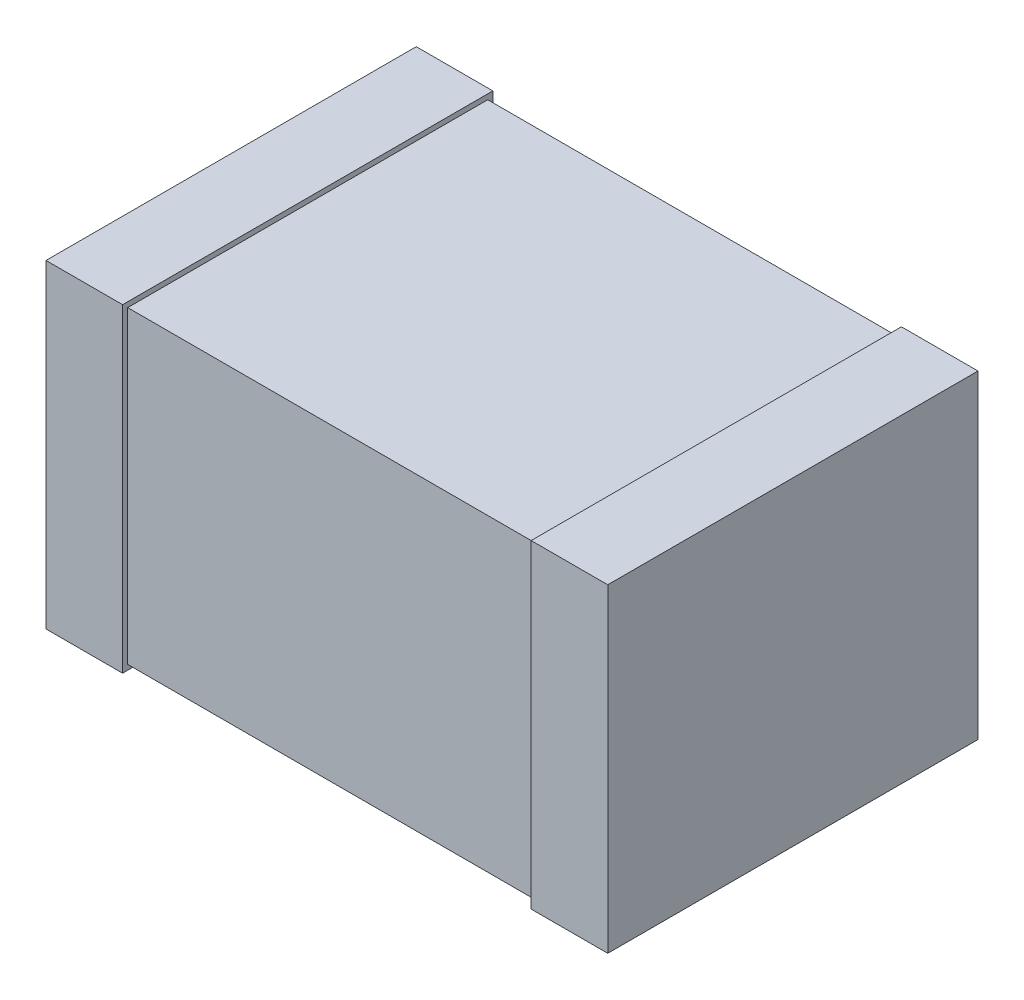
ISO-10303-21;
HEADER;
FILE_DESCRIPTION(('STEP AP214'),'2;1');
FILE_NAME('part.step','',(''),(''),'','','');
FILE_SCHEMA(('AUTOMOTIVE_DESIGN { 1 0 10303 214 1 1 1 1 }'));
ENDSEC;
DATA;
#1=APPLICATION_CONTEXT('core data for automotive mechanical design processes');
#2=APPLICATION_PROTOCOL_DEFINITION('international standard','automotive_design',2000,#1);
#3=PRODUCT_CONTEXT('',#1,'mechanical');
#4=PRODUCT('Part','Part','',(#3));
#5=PRODUCT_RELATED_PRODUCT_CATEGORY('part','',(#4));
#6=PRODUCT_DEFINITION_FORMATION('','',#4);
#7=PRODUCT_DEFINITION_CONTEXT('part definition',#1,'design');
#8=PRODUCT_DEFINITION('design','',#6,#7);
#9=PRODUCT_DEFINITION_SHAPE('','',#8);
#10=(LENGTH_UNIT() NAMED_UNIT(*) SI_UNIT(.MILLI.,.METRE.));
#11=(NAMED_UNIT(*) PLANE_ANGLE_UNIT() SI_UNIT($,.RADIAN.));
#12=(NAMED_UNIT(*) SI_UNIT($,.STERADIAN.) SOLID_ANGLE_UNIT());
#13=UNCERTAINTY_MEASURE_WITH_UNIT(LENGTH_MEASURE(1.E-05),#10,'distance_accuracy_value','');
#14=(GEOMETRIC_REPRESENTATION_CONTEXT(3) GLOBAL_UNCERTAINTY_ASSIGNED_CONTEXT((#13)) GLOBAL_UNIT_ASSIGNED_CONTEXT((#10,
#11,#12)) REPRESENTATION_CONTEXT('',''));
#15=CARTESIAN_POINT('',(0.,0.,0.));
#16=DIRECTION('',(0.,0.,1.));
#17=DIRECTION('',(1.,0.,0.));
#18=AXIS2_PLACEMENT_3D('',#15,#16,#17);
#19=CARTESIAN_POINT('',(-399995.047,4.2056000003022,5.3402000000111));
#20=DIRECTION('',(0.,1.,0.));
#21=DIRECTION('',(1.,0.,0.));
#22=AXIS2_PLACEMENT_3D('',#19,#20,#21);
#23=PLANE('',#22);
#24=DIRECTION('',(-1.,0.,0.));
#25=VECTOR('',#24,1.);
#26=CARTESIAN_POINT('',(-399995.047,4.2056000003022,6.7502000000111));
#27=LINE('',#26,#25);
#28=CARTESIAN_POINT('',(5.7530000000265,4.2056000000209,6.7502));
#29=VERTEX_POINT('',#28);
#30=CARTESIAN_POINT('',(4.152999999986,4.2056000000209,6.7502));
#31=VERTEX_POINT('',#30);
#32=EDGE_CURVE('E11',#29,#31,#27,.T.);
#33=ORIENTED_EDGE('',*,*,#32,.F.);
#34=DIRECTION('',(0.,0.,1.));
#35=VECTOR('',#34,1.);
#36=CARTESIAN_POINT('',(5.7530000000265,4.2056000000209,5.3402));
#37=LINE('',#36,#35);
#38=CARTESIAN_POINT('',(5.7530000000265,4.2056000000209,5.3402));
#39=VERTEX_POINT('',#38);
#40=EDGE_CURVE('E24',#39,#29,#37,.T.);
#41=ORIENTED_EDGE('',*,*,#40,.F.);
#42=DIRECTION('',(-1.,0.,0.));
#43=VECTOR('',#42,1.);
#44=CARTESIAN_POINT('',(-399995.047,4.2056000003022,5.3402000000111));
#45=LINE('',#44,#43);
#46=CARTESIAN_POINT('',(4.1529999999734,4.2056000000209,5.3402));
#47=VERTEX_POINT('',#46);
#48=EDGE_CURVE('E198',#39,#47,#45,.T.);
#49=ORIENTED_EDGE('',*,*,#48,.T.);
#50=DIRECTION('',(0.,0.,1.));
#51=VECTOR('',#50,1.);
#52=CARTESIAN_POINT('',(4.1529999999734,4.2056000000209,5.3402));
#53=LINE('',#52,#51);
#54=EDGE_CURVE('E196',#47,#31,#53,.T.);
#55=ORIENTED_EDGE('',*,*,#54,.T.);
#56=EDGE_LOOP('',(#33,#41,#49,#55));
#57=FACE_BOUND('',#56,.T.);
#58=ADVANCED_FACE('F17',(#57),#23,.T.);
#59=CARTESIAN_POINT('',(-399995.047,2.9956000002876,5.3402000000111));
#60=DIRECTION('',(0.,-1.,0.));
#61=DIRECTION('',(-1.,0.,0.));
#62=AXIS2_PLACEMENT_3D('',#59,#60,#61);
#63=PLANE('',#62);
#64=DIRECTION('',(1.,0.,0.));
#65=VECTOR('',#64,1.);
#66=CARTESIAN_POINT('',(-399995.047,2.9956000002876,6.7502000000111));
#67=LINE('',#66,#65);
#68=CARTESIAN_POINT('',(4.1529999999734,2.9956000000063,6.7502));
#69=VERTEX_POINT('',#68);
#70=CARTESIAN_POINT('',(5.7530000000265,2.9956000000063,6.7502));
#71=VERTEX_POINT('',#70);
#72=EDGE_CURVE('E194',#69,#71,#67,.T.);
#73=ORIENTED_EDGE('',*,*,#72,.F.);
#74=DIRECTION('',(0.,0.,1.));
#75=VECTOR('',#74,1.);
#76=CARTESIAN_POINT('',(4.1529999999734,2.9956000000063,5.3402));
#77=LINE('',#76,#75);
#78=CARTESIAN_POINT('',(4.1529999999734,2.9956000000063,5.3402));
#79=VERTEX_POINT('',#78);
#80=EDGE_CURVE('E191',#79,#69,#77,.T.);
#81=ORIENTED_EDGE('',*,*,#80,.F.);
#82=DIRECTION('',(1.,0.,0.));
#83=VECTOR('',#82,1.);
#84=CARTESIAN_POINT('',(-399995.047,2.9956000002876,5.3402000000111));
#85=LINE('',#84,#83);
#86=CARTESIAN_POINT('',(5.7530000000265,2.9956000000063,5.3402));
#87=VERTEX_POINT('',#86);
#88=EDGE_CURVE('E189',#79,#87,#85,.T.);
#89=ORIENTED_EDGE('',*,*,#88,.T.);
#90=DIRECTION('',(0.,0.,1.));
#91=VECTOR('',#90,1.);
#92=CARTESIAN_POINT('',(5.7530000000265,2.9956000000063,5.3402));
#93=LINE('',#92,#91);
#94=EDGE_CURVE('E186',#87,#71,#93,.T.);
#95=ORIENTED_EDGE('',*,*,#94,.T.);
#96=EDGE_LOOP('',(#73,#81,#89,#95));
#97=FACE_BOUND('',#96,.T.);
#98=ADVANCED_FACE('F208',(#97),#63,.T.);
#99=CARTESIAN_POINT('',(4.1529999999734,4.2056000000209,5.3402));
#100=DIRECTION('',(0.,0.,1.));
#101=DIRECTION('',(0.,-1.,0.));
#102=AXIS2_PLACEMENT_3D('',#99,#100,#101);
#103=PLANE('',#102);
#104=ORIENTED_EDGE('',*,*,#48,.F.);
#105=DIRECTION('',(0.,1.,0.));
#106=VECTOR('',#105,1.);
#107=CARTESIAN_POINT('',(5.7530000002316,291602.9081,5.3402000000573));
#108=LINE('',#107,#106);
#109=EDGE_CURVE('E183',#87,#39,#108,.T.);
#110=ORIENTED_EDGE('',*,*,#109,.F.);
#111=ORIENTED_EDGE('',*,*,#88,.F.);
#112=DIRECTION('',(0.,-1.,0.));
#113=VECTOR('',#112,1.);
#114=CARTESIAN_POINT('',(4.1530000001785,291602.9081,5.3402000000573));
#115=LINE('',#114,#113);
#116=EDGE_CURVE('E180',#47,#79,#115,.T.);
#117=ORIENTED_EDGE('',*,*,#116,.F.);
#118=EDGE_LOOP('',(#104,#110,#111,#117));
#119=FACE_BOUND('',#118,.T.);
#120=ADVANCED_FACE('F211',(#119),#103,.F.);
#121=CARTESIAN_POINT('',(4.1529999999734,4.2056000000209,6.7502));
#122=DIRECTION('',(0.,0.,1.));
#123=DIRECTION('',(0.,-1.,0.));
#124=AXIS2_PLACEMENT_3D('',#121,#122,#123);
#125=PLANE('',#124);
#126=ORIENTED_EDGE('',*,*,#32,.T.);
#127=DIRECTION('',(0.,-1.,0.));
#128=VECTOR('',#127,1.);
#129=CARTESIAN_POINT('',(4.1530000001785,291602.9081,6.7502000000573));
#130=LINE('',#129,#128);
#131=EDGE_CURVE('E178',#31,#69,#130,.T.);
#132=ORIENTED_EDGE('',*,*,#131,.T.);
#133=ORIENTED_EDGE('',*,*,#72,.T.);
#134=DIRECTION('',(0.,1.,0.));
#135=VECTOR('',#134,1.);
#136=CARTESIAN_POINT('',(5.7530000002316,291602.9081,6.7502000000573));
#137=LINE('',#136,#135);
#138=EDGE_CURVE('E176',#71,#29,#137,.T.);
#139=ORIENTED_EDGE('',*,*,#138,.T.);
#140=EDGE_LOOP('',(#126,#132,#133,#139));
#141=FACE_BOUND('',#140,.T.);
#142=ADVANCED_FACE('F205',(#141),#125,.T.);
#143=CARTESIAN_POINT('',(5.7530000002316,291602.9081,5.3202000000573));
#144=DIRECTION('',(-1.,0.,0.));
#145=DIRECTION('',(0.,1.,0.));
#146=AXIS2_PLACEMENT_3D('',#143,#144,#145);
#147=PLANE('',#146);
#148=DIRECTION('',(0.,-1.,0.));
#149=VECTOR('',#148,1.);
#150=CARTESIAN_POINT('',(5.7530000002316,291602.9081,6.7702000000573));
#151=LINE('',#150,#149);
#152=CARTESIAN_POINT('',(5.7530000000265,4.2256000000273,6.7702));
#153=VERTEX_POINT('',#152);
#154=CARTESIAN_POINT('',(5.7530000000265,2.9756000000049,6.7702));
#155=VERTEX_POINT('',#154);
#156=EDGE_CURVE('E174',#153,#155,#151,.T.);
#157=ORIENTED_EDGE('',*,*,#156,.F.);
#158=DIRECTION('',(0.,0.,1.));
#159=VECTOR('',#158,1.);
#160=CARTESIAN_POINT('',(5.7530000000265,4.2256000000273,5.3202));
#161=LINE('',#160,#159);
#162=CARTESIAN_POINT('',(5.7530000000265,4.2256000000273,5.3202));
#163=VERTEX_POINT('',#162);
#164=EDGE_CURVE('E171',#163,#153,#161,.T.);
#165=ORIENTED_EDGE('',*,*,#164,.F.);
#166=DIRECTION('',(0.,-1.,0.));
#167=VECTOR('',#166,1.);
#168=CARTESIAN_POINT('',(5.7530000002316,291602.9081,5.3202000000573));
#169=LINE('',#168,#167);
#170=CARTESIAN_POINT('',(5.7530000000265,2.9756000000049,5.3202));
#171=VERTEX_POINT('',#170);
#172=EDGE_CURVE('E169',#163,#171,#169,.T.);
#173=ORIENTED_EDGE('',*,*,#172,.T.);
#174=DIRECTION('',(0.,0.,1.));
#175=VECTOR('',#174,1.);
#176=CARTESIAN_POINT('',(5.7530000000265,2.9756000000049,5.3202));
#177=LINE('',#176,#175);
#178=EDGE_CURVE('E166',#171,#155,#177,.T.);
#179=ORIENTED_EDGE('',*,*,#178,.T.);
#180=EDGE_LOOP('',(#157,#165,#173,#179));
#181=FACE_BOUND('',#180,.T.);
#182=ORIENTED_EDGE('',*,*,#109,.T.);
#183=ORIENTED_EDGE('',*,*,#40,.T.);
#184=ORIENTED_EDGE('',*,*,#138,.F.);
#185=ORIENTED_EDGE('',*,*,#94,.F.);
#186=EDGE_LOOP('',(#182,#183,#184,#185));
#187=FACE_BOUND('',#186,.T.);
#188=ADVANCED_FACE('F201',(#181,#187),#147,.T.);
#189=CARTESIAN_POINT('',(6.0530000002131,291602.9081,5.3202000000573));
#190=DIRECTION('',(1.,0.,0.));
#191=DIRECTION('',(0.,-1.,0.));
#192=AXIS2_PLACEMENT_3D('',#189,#190,#191);
#193=PLANE('',#192);
#194=DIRECTION('',(0.,1.,0.));
#195=VECTOR('',#194,1.);
#196=CARTESIAN_POINT('',(6.0530000002131,291602.9081,6.7702000000573));
#197=LINE('',#196,#195);
#198=CARTESIAN_POINT('',(6.0530000000081,2.9756000000049,6.7702));
#199=VERTEX_POINT('',#198);
#200=CARTESIAN_POINT('',(6.0530000000081,4.2256000000273,6.7702));
#201=VERTEX_POINT('',#200);
#202=EDGE_CURVE('E164',#199,#201,#197,.T.);
#203=ORIENTED_EDGE('',*,*,#202,.F.);
#204=DIRECTION('',(0.,0.,1.));
#205=VECTOR('',#204,1.);
#206=CARTESIAN_POINT('',(6.0530000000081,2.9756000000049,5.3202));
#207=LINE('',#206,#205);
#208=CARTESIAN_POINT('',(6.0530000000081,2.9756000000049,5.3202));
#209=VERTEX_POINT('',#208);
#210=EDGE_CURVE('E161',#209,#199,#207,.T.);
#211=ORIENTED_EDGE('',*,*,#210,.F.);
#212=DIRECTION('',(0.,1.,0.));
#213=VECTOR('',#212,1.);
#214=CARTESIAN_POINT('',(6.0530000002131,291602.9081,5.3202000000573));
#215=LINE('',#214,#213);
#216=CARTESIAN_POINT('',(6.0530000000081,4.2256000000273,5.3202));
#217=VERTEX_POINT('',#216);
#218=EDGE_CURVE('E159',#209,#217,#215,.T.);
#219=ORIENTED_EDGE('',*,*,#218,.T.);
#220=DIRECTION('',(0.,0.,1.));
#221=VECTOR('',#220,1.);
#222=CARTESIAN_POINT('',(6.0530000000081,4.2256000000273,5.3202));
#223=LINE('',#222,#221);
#224=EDGE_CURVE('E156',#217,#201,#223,.T.);
#225=ORIENTED_EDGE('',*,*,#224,.T.);
#226=EDGE_LOOP('',(#203,#211,#219,#225));
#227=FACE_BOUND('',#226,.T.);
#228=ADVANCED_FACE('F240',(#227),#193,.T.);
#229=CARTESIAN_POINT('',(-399995.047,2.975599999997,5.3202000000111));
#230=DIRECTION('',(0.,-1.,0.));
#231=DIRECTION('',(-1.,0.,0.));
#232=AXIS2_PLACEMENT_3D('',#229,#230,#231);
#233=PLANE('',#232);
#234=DIRECTION('',(1.,0.,0.));
#235=VECTOR('',#234,1.);
#236=CARTESIAN_POINT('',(-399995.047,2.975599999997,6.7702000000111));
#237=LINE('',#236,#235);
#238=EDGE_CURVE('E153',#155,#199,#237,.T.);
#239=ORIENTED_EDGE('',*,*,#238,.F.);
#240=ORIENTED_EDGE('',*,*,#178,.F.);
#241=DIRECTION('',(1.,0.,0.));
#242=VECTOR('',#241,1.);
#243=CARTESIAN_POINT('',(-399995.047,2.975599999997,5.3202000000111));
#244=LINE('',#243,#242);
#245=EDGE_CURVE('E150',#171,#209,#244,.T.);
#246=ORIENTED_EDGE('',*,*,#245,.T.);
#247=ORIENTED_EDGE('',*,*,#210,.T.);
#248=EDGE_LOOP('',(#239,#240,#246,#247));
#249=FACE_BOUND('',#248,.T.);
#250=ADVANCED_FACE('F244',(#249),#233,.T.);
#251=CARTESIAN_POINT('',(-399995.047,4.2256000003085,5.3202000000111));
#252=DIRECTION('',(0.,1.,0.));
#253=DIRECTION('',(1.,0.,0.));
#254=AXIS2_PLACEMENT_3D('',#251,#252,#253);
#255=PLANE('',#254);
#256=DIRECTION('',(-1.,0.,0.));
#257=VECTOR('',#256,1.);
#258=CARTESIAN_POINT('',(-399995.047,4.2256000003085,6.7702000000111));
#259=LINE('',#258,#257);
#260=EDGE_CURVE('E147',#201,#153,#259,.T.);
#261=ORIENTED_EDGE('',*,*,#260,.F.);
#262=ORIENTED_EDGE('',*,*,#224,.F.);
#263=DIRECTION('',(-1.,0.,0.));
#264=VECTOR('',#263,1.);
#265=CARTESIAN_POINT('',(-399995.047,4.2256000003085,5.3202000000111));
#266=LINE('',#265,#264);
#267=EDGE_CURVE('E144',#217,#163,#266,.T.);
#268=ORIENTED_EDGE('',*,*,#267,.T.);
#269=ORIENTED_EDGE('',*,*,#164,.T.);
#270=EDGE_LOOP('',(#261,#262,#268,#269));
#271=FACE_BOUND('',#270,.T.);
#272=ADVANCED_FACE('F248',(#271),#255,.T.);
#273=CARTESIAN_POINT('',(6.0530000000081,4.2256000000273,5.3202));
#274=DIRECTION('',(0.,0.,1.));
#275=DIRECTION('',(0.,-1.,0.));
#276=AXIS2_PLACEMENT_3D('',#273,#274,#275);
#277=PLANE('',#276);
#278=ORIENTED_EDGE('',*,*,#218,.F.);
#279=ORIENTED_EDGE('',*,*,#245,.F.);
#280=ORIENTED_EDGE('',*,*,#172,.F.);
#281=ORIENTED_EDGE('',*,*,#267,.F.);
#282=EDGE_LOOP('',(#278,#279,#280,#281));
#283=FACE_BOUND('',#282,.T.);
#284=ADVANCED_FACE('F226',(#283),#277,.F.);
#285=CARTESIAN_POINT('',(6.0530000000081,4.2256000000273,6.7702));
#286=DIRECTION('',(0.,0.,1.));
#287=DIRECTION('',(0.,-1.,0.));
#288=AXIS2_PLACEMENT_3D('',#285,#286,#287);
#289=PLANE('',#288);
#290=ORIENTED_EDGE('',*,*,#202,.T.);
#291=ORIENTED_EDGE('',*,*,#260,.T.);
#292=ORIENTED_EDGE('',*,*,#156,.T.);
#293=ORIENTED_EDGE('',*,*,#238,.T.);
#294=EDGE_LOOP('',(#290,#291,#292,#293));
#295=FACE_BOUND('',#294,.T.);
#296=ADVANCED_FACE('F217',(#295),#289,.T.);
#297=CARTESIAN_POINT('',(4.1530000002921,291602.9081,5.3202000000573));
#298=DIRECTION('',(1.,0.,0.));
#299=DIRECTION('',(0.,-1.,0.));
#300=AXIS2_PLACEMENT_3D('',#297,#298,#299);
#301=PLANE('',#300);
#302=DIRECTION('',(0.,1.,0.));
#303=VECTOR('',#302,1.);
#304=CARTESIAN_POINT('',(4.1530000002921,291602.9081,6.7702000000573));
#305=LINE('',#304,#303);
#306=CARTESIAN_POINT('',(4.1529999999859,2.9756,6.7702));
#307=VERTEX_POINT('',#306);
#308=CARTESIAN_POINT('',(4.1529999999734,4.2256000000273,6.7702));
#309=VERTEX_POINT('',#308);
#310=EDGE_CURVE('E142',#307,#309,#305,.T.);
#311=ORIENTED_EDGE('',*,*,#310,.F.);
#312=DIRECTION('',(0.,0.,1.));
#313=VECTOR('',#312,1.);
#314=CARTESIAN_POINT('',(4.1529999999859,2.9756,5.3202));
#315=LINE('',#314,#313);
#316=CARTESIAN_POINT('',(4.1529999999859,2.9756,5.3202));
#317=VERTEX_POINT('',#316);
#318=EDGE_CURVE('E140',#317,#307,#315,.T.);
#319=ORIENTED_EDGE('',*,*,#318,.F.);
#320=DIRECTION('',(0.,1.,0.));
#321=VECTOR('',#320,1.);
#322=CARTESIAN_POINT('',(4.1530000002921,291602.9081,5.3202000000573));
#323=LINE('',#322,#321);
#324=CARTESIAN_POINT('',(4.1529999999734,4.2256000000273,5.3202));
#325=VERTEX_POINT('',#324);
#326=EDGE_CURVE('E125',#317,#325,#323,.T.);
#327=ORIENTED_EDGE('',*,*,#326,.T.);
#328=DIRECTION('',(0.,0.,1.));
#329=VECTOR('',#328,1.);
#330=CARTESIAN_POINT('',(4.1529999999734,4.2256000000273,5.3202));
#331=LINE('',#330,#329);
#332=EDGE_CURVE('E136',#325,#309,#331,.T.);
#333=ORIENTED_EDGE('',*,*,#332,.T.);
#334=EDGE_LOOP('',(#311,#319,#327,#333));
#335=FACE_BOUND('',#334,.T.);
#336=ORIENTED_EDGE('',*,*,#116,.T.);
#337=ORIENTED_EDGE('',*,*,#80,.T.);
#338=ORIENTED_EDGE('',*,*,#131,.F.);
#339=ORIENTED_EDGE('',*,*,#54,.F.);
#340=EDGE_LOOP('',(#336,#337,#338,#339));
#341=FACE_BOUND('',#340,.T.);
#342=ADVANCED_FACE('F215',(#335,#341),#301,.T.);
#343=CARTESIAN_POINT('',(3.8530000003106,291602.9081,5.3202000000573));
#344=DIRECTION('',(-1.,0.,0.));
#345=DIRECTION('',(0.,1.,0.));
#346=AXIS2_PLACEMENT_3D('',#343,#344,#345);
#347=PLANE('',#346);
#348=DIRECTION('',(0.,-1.,0.));
#349=VECTOR('',#348,1.);
#350=CARTESIAN_POINT('',(3.8530000003106,291602.9081,6.7702000000573));
#351=LINE('',#350,#349);
#352=CARTESIAN_POINT('',(3.8529999999919,4.2256000000273,6.7702));
#353=VERTEX_POINT('',#352);
#354=CARTESIAN_POINT('',(3.8529999999919,2.9756000000108,6.7702));
#355=VERTEX_POINT('',#354);
#356=EDGE_CURVE('E134',#353,#355,#351,.T.);
#357=ORIENTED_EDGE('',*,*,#356,.F.);
#358=DIRECTION('',(0.,0.,1.));
#359=VECTOR('',#358,1.);
#360=CARTESIAN_POINT('',(3.8529999999919,4.2256000000273,5.3202));
#361=LINE('',#360,#359);
#362=CARTESIAN_POINT('',(3.8529999999919,4.2256000000273,5.3202));
#363=VERTEX_POINT('',#362);
#364=EDGE_CURVE('E108',#363,#353,#361,.T.);
#365=ORIENTED_EDGE('',*,*,#364,.F.);
#366=DIRECTION('',(0.,-1.,0.));
#367=VECTOR('',#366,1.);
#368=CARTESIAN_POINT('',(3.8530000003106,291602.9081,5.3202000000573));
#369=LINE('',#368,#367);
#370=CARTESIAN_POINT('',(3.8529999999919,2.9756000000108,5.3202));
#371=VERTEX_POINT('',#370);
#372=EDGE_CURVE('E102',#363,#371,#369,.T.);
#373=ORIENTED_EDGE('',*,*,#372,.T.);
#374=DIRECTION('',(0.,0.,1.));
#375=VECTOR('',#374,1.);
#376=CARTESIAN_POINT('',(3.8529999999919,2.9756000000108,5.3202));
#377=LINE('',#376,#375);
#378=EDGE_CURVE('E105',#371,#355,#377,.T.);
#379=ORIENTED_EDGE('',*,*,#378,.T.);
#380=EDGE_LOOP('',(#357,#365,#373,#379));
#381=FACE_BOUND('',#380,.T.);
#382=ADVANCED_FACE('F104',(#381),#347,.T.);
#383=CARTESIAN_POINT('',(-399995.047,4.2256000003085,5.3202000000111));
#384=DIRECTION('',(0.,1.,0.));
#385=DIRECTION('',(1.,0.,0.));
#386=AXIS2_PLACEMENT_3D('',#383,#384,#385);
#387=PLANE('',#386);
#388=DIRECTION('',(-1.,0.,0.));
#389=VECTOR('',#388,1.);
#390=CARTESIAN_POINT('',(-399995.047,4.2256000003085,6.7702000000111));
#391=LINE('',#390,#389);
#392=EDGE_CURVE('E121',#309,#353,#391,.T.);
#393=ORIENTED_EDGE('',*,*,#392,.F.);
#394=ORIENTED_EDGE('',*,*,#332,.F.);
#395=DIRECTION('',(-1.,0.,0.));
#396=VECTOR('',#395,1.);
#397=CARTESIAN_POINT('',(-399995.047,4.2256000003085,5.3202000000111));
#398=LINE('',#397,#396);
#399=EDGE_CURVE('E127',#325,#363,#398,.T.);
#400=ORIENTED_EDGE('',*,*,#399,.T.);
#401=ORIENTED_EDGE('',*,*,#364,.T.);
#402=EDGE_LOOP('',(#393,#394,#400,#401));
#403=FACE_BOUND('',#402,.T.);
#404=ADVANCED_FACE('F224',(#403),#387,.T.);
#405=CARTESIAN_POINT('',(-399995.047,2.9756000006791,5.3202000000111));
#406=DIRECTION('',(0.,-1.,0.));
#407=DIRECTION('',(-1.,0.,0.));
#408=AXIS2_PLACEMENT_3D('',#405,#406,#407);
#409=PLANE('',#408);
#410=DIRECTION('',(1.,0.,0.));
#411=VECTOR('',#410,1.);
#412=CARTESIAN_POINT('',(-399995.047,2.9756000006791,6.7702000000111));
#413=LINE('',#412,#411);
#414=EDGE_CURVE('E120',#355,#307,#413,.T.);
#415=ORIENTED_EDGE('',*,*,#414,.F.);
#416=ORIENTED_EDGE('',*,*,#378,.F.);
#417=DIRECTION('',(1.,0.,0.));
#418=VECTOR('',#417,1.);
#419=CARTESIAN_POINT('',(-399995.047,2.9756000006791,5.3202000000111));
#420=LINE('',#419,#418);
#421=EDGE_CURVE('E118',#371,#317,#420,.T.);
#422=ORIENTED_EDGE('',*,*,#421,.T.);
#423=ORIENTED_EDGE('',*,*,#318,.T.);
#424=EDGE_LOOP('',(#415,#416,#422,#423));
#425=FACE_BOUND('',#424,.T.);
#426=ADVANCED_FACE('F116',(#425),#409,.T.);
#427=CARTESIAN_POINT('',(3.8529999999919,2.9756000000108,5.3202));
#428=DIRECTION('',(0.,0.,1.));
#429=DIRECTION('',(0.,-1.,0.));
#430=AXIS2_PLACEMENT_3D('',#427,#428,#429);
#431=PLANE('',#430);
#432=ORIENTED_EDGE('',*,*,#372,.F.);
#433=ORIENTED_EDGE('',*,*,#399,.F.);
#434=ORIENTED_EDGE('',*,*,#326,.F.);
#435=ORIENTED_EDGE('',*,*,#421,.F.);
#436=EDGE_LOOP('',(#432,#433,#434,#435));
#437=FACE_BOUND('',#436,.T.);
#438=ADVANCED_FACE('F124',(#437),#431,.F.);
#439=CARTESIAN_POINT('',(3.8529999999919,2.9756000000108,6.7702));
#440=DIRECTION('',(0.,0.,1.));
#441=DIRECTION('',(0.,-1.,0.));
#442=AXIS2_PLACEMENT_3D('',#439,#440,#441);
#443=PLANE('',#442);
#444=ORIENTED_EDGE('',*,*,#356,.T.);
#445=ORIENTED_EDGE('',*,*,#414,.T.);
#446=ORIENTED_EDGE('',*,*,#310,.T.);
#447=ORIENTED_EDGE('',*,*,#392,.T.);
#448=EDGE_LOOP('',(#444,#445,#446,#447));
#449=FACE_BOUND('',#448,.T.);
#450=ADVANCED_FACE('F312',(#449),#443,.T.);
#451=CLOSED_SHELL('',(#58,#98,#120,#142,#188,#228,#250,#272,#284,#296,#342,#382,#404,#426,#438,#450));
#452=MANIFOLD_SOLID_BREP('B1',#451);
#453=ADVANCED_BREP_SHAPE_REPRESENTATION('',(#18,#452),#14);
#454=SHAPE_DEFINITION_REPRESENTATION(#9,#453);
ENDSEC;
END-ISO-10303-21;
